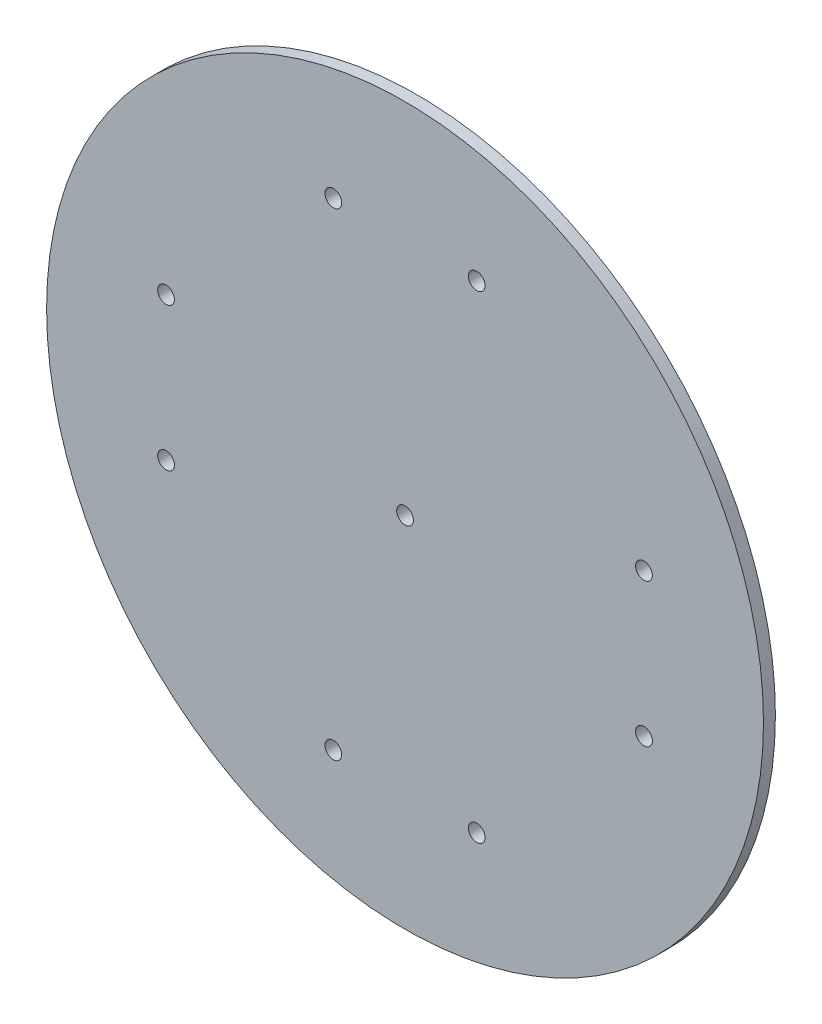
ISO-10303-21;
HEADER;
FILE_DESCRIPTION(('STEP AP214'),'2;1');
FILE_NAME('part.step','',(''),(''),'','','');
FILE_SCHEMA(('AUTOMOTIVE_DESIGN { 1 0 10303 214 1 1 1 1 }'));
ENDSEC;
DATA;
#1=APPLICATION_CONTEXT('core data for automotive mechanical design processes');
#2=APPLICATION_PROTOCOL_DEFINITION('international standard','automotive_design',2000,#1);
#3=PRODUCT_CONTEXT('',#1,'mechanical');
#4=PRODUCT('Part','Part','',(#3));
#5=PRODUCT_RELATED_PRODUCT_CATEGORY('part','',(#4));
#6=PRODUCT_DEFINITION_FORMATION('','',#4);
#7=PRODUCT_DEFINITION_CONTEXT('part definition',#1,'design');
#8=PRODUCT_DEFINITION('design','',#6,#7);
#9=PRODUCT_DEFINITION_SHAPE('','',#8);
#10=(LENGTH_UNIT() NAMED_UNIT(*) SI_UNIT(.MILLI.,.METRE.));
#11=(NAMED_UNIT(*) PLANE_ANGLE_UNIT() SI_UNIT($,.RADIAN.));
#12=(NAMED_UNIT(*) SI_UNIT($,.STERADIAN.) SOLID_ANGLE_UNIT());
#13=UNCERTAINTY_MEASURE_WITH_UNIT(LENGTH_MEASURE(1.E-05),#10,'distance_accuracy_value','');
#14=(GEOMETRIC_REPRESENTATION_CONTEXT(3) GLOBAL_UNCERTAINTY_ASSIGNED_CONTEXT((#13)) GLOBAL_UNIT_ASSIGNED_CONTEXT((#10,
#11,#12)) REPRESENTATION_CONTEXT('',''));
#15=CARTESIAN_POINT('',(0.,0.,0.));
#16=DIRECTION('',(0.,0.,1.));
#17=DIRECTION('',(1.,0.,0.));
#18=AXIS2_PLACEMENT_3D('',#15,#16,#17);
#19=CARTESIAN_POINT('',(0.,0.,2.5));
#20=DIRECTION('',(0.,0.,-1.));
#21=DIRECTION('',(-1.,0.,0.));
#22=AXIS2_PLACEMENT_3D('',#19,#20,#21);
#23=CYLINDRICAL_SURFACE('',#22,75.);
#24=CARTESIAN_POINT('',(0.,0.,2.5));
#25=DIRECTION('',(0.,0.,1.));
#26=DIRECTION('',(1.,0.,0.));
#27=AXIS2_PLACEMENT_3D('',#24,#25,#26);
#28=CIRCLE('',#27,75.);
#29=CARTESIAN_POINT('',(75.,0.,2.5));
#30=VERTEX_POINT('',#29);
#31=EDGE_CURVE('E10',#30,#30,#28,.T.);
#32=ORIENTED_EDGE('',*,*,#31,.F.);
#33=EDGE_LOOP('',(#32));
#34=FACE_BOUND('',#33,.T.);
#35=CARTESIAN_POINT('',(0.,0.,0.));
#36=DIRECTION('',(0.,0.,1.));
#37=DIRECTION('',(1.,0.,0.));
#38=AXIS2_PLACEMENT_3D('',#35,#36,#37);
#39=CIRCLE('',#38,75.);
#40=CARTESIAN_POINT('',(75.,0.,0.));
#41=VERTEX_POINT('',#40);
#42=EDGE_CURVE('E38',#41,#41,#39,.T.);
#43=ORIENTED_EDGE('',*,*,#42,.T.);
#44=EDGE_LOOP('',(#43));
#45=FACE_BOUND('',#44,.T.);
#46=ADVANCED_FACE('F35',(#34,#45),#23,.T.);
#47=CARTESIAN_POINT('',(0.,0.,2.5));
#48=DIRECTION('',(0.,0.,1.));
#49=DIRECTION('',(1.,0.,0.));
#50=AXIS2_PLACEMENT_3D('',#47,#48,#49);
#51=PLANE('',#50);
#52=CARTESIAN_POINT('',(0.,0.,2.5));
#53=DIRECTION('',(0.,0.,-1.));
#54=DIRECTION('',(-1.,0.,0.));
#55=AXIS2_PLACEMENT_3D('',#52,#53,#54);
#56=CIRCLE('',#55,1.75);
#57=CARTESIAN_POINT('',(-1.75,0.,2.5));
#58=VERTEX_POINT('',#57);
#59=EDGE_CURVE('E70',#58,#58,#56,.T.);
#60=ORIENTED_EDGE('',*,*,#59,.T.);
#61=EDGE_LOOP('',(#60));
#62=FACE_BOUND('',#61,.T.);
#63=CARTESIAN_POINT('',(-50.,15.,2.5));
#64=DIRECTION('',(0.,0.,-1.));
#65=DIRECTION('',(-1.,0.,0.));
#66=AXIS2_PLACEMENT_3D('',#63,#64,#65);
#67=CIRCLE('',#66,1.75);
#68=CARTESIAN_POINT('',(-51.75,15.,2.5));
#69=VERTEX_POINT('',#68);
#70=EDGE_CURVE('E60',#69,#69,#67,.T.);
#71=ORIENTED_EDGE('',*,*,#70,.T.);
#72=EDGE_LOOP('',(#71));
#73=FACE_BOUND('',#72,.T.);
#74=CARTESIAN_POINT('',(15.,50.,2.5));
#75=DIRECTION('',(0.,0.,-1.));
#76=DIRECTION('',(-1.,0.,0.));
#77=AXIS2_PLACEMENT_3D('',#74,#75,#76);
#78=CIRCLE('',#77,1.75);
#79=CARTESIAN_POINT('',(13.25,50.,2.5));
#80=VERTEX_POINT('',#79);
#81=EDGE_CURVE('E53',#80,#80,#78,.T.);
#82=ORIENTED_EDGE('',*,*,#81,.T.);
#83=EDGE_LOOP('',(#82));
#84=FACE_BOUND('',#83,.T.);
#85=CARTESIAN_POINT('',(-15.,50.,2.5));
#86=DIRECTION('',(0.,0.,-1.));
#87=DIRECTION('',(-1.,0.,0.));
#88=AXIS2_PLACEMENT_3D('',#85,#86,#87);
#89=CIRCLE('',#88,1.75);
#90=CARTESIAN_POINT('',(-16.75,50.,2.5));
#91=VERTEX_POINT('',#90);
#92=EDGE_CURVE('E67',#91,#91,#89,.T.);
#93=ORIENTED_EDGE('',*,*,#92,.T.);
#94=EDGE_LOOP('',(#93));
#95=FACE_BOUND('',#94,.T.);
#96=CARTESIAN_POINT('',(-50.,-15.,2.5));
#97=DIRECTION('',(0.,0.,-1.));
#98=DIRECTION('',(-1.,0.,0.));
#99=AXIS2_PLACEMENT_3D('',#96,#97,#98);
#100=CIRCLE('',#99,1.75);
#101=CARTESIAN_POINT('',(-51.75,-15.,2.5));
#102=VERTEX_POINT('',#101);
#103=EDGE_CURVE('E66',#102,#102,#100,.T.);
#104=ORIENTED_EDGE('',*,*,#103,.T.);
#105=EDGE_LOOP('',(#104));
#106=FACE_BOUND('',#105,.T.);
#107=CARTESIAN_POINT('',(-15.,-50.,2.5));
#108=DIRECTION('',(0.,0.,-1.));
#109=DIRECTION('',(-1.,0.,0.));
#110=AXIS2_PLACEMENT_3D('',#107,#108,#109);
#111=CIRCLE('',#110,1.75);
#112=CARTESIAN_POINT('',(-16.75,-50.,2.5));
#113=VERTEX_POINT('',#112);
#114=EDGE_CURVE('E78',#113,#113,#111,.T.);
#115=ORIENTED_EDGE('',*,*,#114,.T.);
#116=EDGE_LOOP('',(#115));
#117=FACE_BOUND('',#116,.T.);
#118=CARTESIAN_POINT('',(15.,-50.,2.5));
#119=DIRECTION('',(0.,0.,-1.));
#120=DIRECTION('',(-1.,0.,0.));
#121=AXIS2_PLACEMENT_3D('',#118,#119,#120);
#122=CIRCLE('',#121,1.75);
#123=CARTESIAN_POINT('',(13.25,-50.,2.5));
#124=VERTEX_POINT('',#123);
#125=EDGE_CURVE('E84',#124,#124,#122,.T.);
#126=ORIENTED_EDGE('',*,*,#125,.T.);
#127=EDGE_LOOP('',(#126));
#128=FACE_BOUND('',#127,.T.);
#129=CARTESIAN_POINT('',(50.,-15.,2.5));
#130=DIRECTION('',(0.,0.,-1.));
#131=DIRECTION('',(-1.,0.,0.));
#132=AXIS2_PLACEMENT_3D('',#129,#130,#131);
#133=CIRCLE('',#132,1.75);
#134=CARTESIAN_POINT('',(48.25,-15.,2.5));
#135=VERTEX_POINT('',#134);
#136=EDGE_CURVE('E90',#135,#135,#133,.T.);
#137=ORIENTED_EDGE('',*,*,#136,.T.);
#138=EDGE_LOOP('',(#137));
#139=FACE_BOUND('',#138,.T.);
#140=CARTESIAN_POINT('',(50.,15.,2.5));
#141=DIRECTION('',(0.,0.,-1.));
#142=DIRECTION('',(-1.,0.,0.));
#143=AXIS2_PLACEMENT_3D('',#140,#141,#142);
#144=CIRCLE('',#143,1.75);
#145=CARTESIAN_POINT('',(48.25,15.,2.5));
#146=VERTEX_POINT('',#145);
#147=EDGE_CURVE('E45',#146,#146,#144,.T.);
#148=ORIENTED_EDGE('',*,*,#147,.T.);
#149=EDGE_LOOP('',(#148));
#150=FACE_BOUND('',#149,.T.);
#151=ORIENTED_EDGE('',*,*,#31,.T.);
#152=EDGE_LOOP('',(#151));
#153=FACE_BOUND('',#152,.T.);
#154=ADVANCED_FACE('F101',(#62,#73,#84,#95,#106,#117,#128,#139,#150,#153),#51,.T.);
#155=CARTESIAN_POINT('',(0.,0.,0.));
#156=DIRECTION('',(0.,0.,1.));
#157=DIRECTION('',(1.,0.,0.));
#158=AXIS2_PLACEMENT_3D('',#155,#156,#157);
#159=PLANE('',#158);
#160=CARTESIAN_POINT('',(0.,0.,0.));
#161=DIRECTION('',(0.,0.,-1.));
#162=DIRECTION('',(-1.,0.,0.));
#163=AXIS2_PLACEMENT_3D('',#160,#161,#162);
#164=CIRCLE('',#163,1.75);
#165=CARTESIAN_POINT('',(-1.75,0.,0.));
#166=VERTEX_POINT('',#165);
#167=EDGE_CURVE('E95',#166,#166,#164,.T.);
#168=ORIENTED_EDGE('',*,*,#167,.F.);
#169=EDGE_LOOP('',(#168));
#170=FACE_BOUND('',#169,.T.);
#171=CARTESIAN_POINT('',(-50.,15.,0.));
#172=DIRECTION('',(0.,0.,-1.));
#173=DIRECTION('',(-1.,0.,0.));
#174=AXIS2_PLACEMENT_3D('',#171,#172,#173);
#175=CIRCLE('',#174,1.75);
#176=CARTESIAN_POINT('',(-51.75,15.,0.));
#177=VERTEX_POINT('',#176);
#178=EDGE_CURVE('E63',#177,#177,#175,.T.);
#179=ORIENTED_EDGE('',*,*,#178,.F.);
#180=EDGE_LOOP('',(#179));
#181=FACE_BOUND('',#180,.T.);
#182=CARTESIAN_POINT('',(15.,50.,0.));
#183=DIRECTION('',(0.,0.,-1.));
#184=DIRECTION('',(-1.,0.,0.));
#185=AXIS2_PLACEMENT_3D('',#182,#183,#184);
#186=CIRCLE('',#185,1.75);
#187=CARTESIAN_POINT('',(13.25,50.,0.));
#188=VERTEX_POINT('',#187);
#189=EDGE_CURVE('E56',#188,#188,#186,.T.);
#190=ORIENTED_EDGE('',*,*,#189,.F.);
#191=EDGE_LOOP('',(#190));
#192=FACE_BOUND('',#191,.T.);
#193=CARTESIAN_POINT('',(-15.,50.,0.));
#194=DIRECTION('',(0.,0.,-1.));
#195=DIRECTION('',(-1.,0.,0.));
#196=AXIS2_PLACEMENT_3D('',#193,#194,#195);
#197=CIRCLE('',#196,1.75);
#198=CARTESIAN_POINT('',(-16.75,50.,0.));
#199=VERTEX_POINT('',#198);
#200=EDGE_CURVE('E57',#199,#199,#197,.T.);
#201=ORIENTED_EDGE('',*,*,#200,.F.);
#202=EDGE_LOOP('',(#201));
#203=FACE_BOUND('',#202,.T.);
#204=CARTESIAN_POINT('',(-50.,-15.,0.));
#205=DIRECTION('',(0.,0.,-1.));
#206=DIRECTION('',(-1.,0.,0.));
#207=AXIS2_PLACEMENT_3D('',#204,#205,#206);
#208=CIRCLE('',#207,1.75);
#209=CARTESIAN_POINT('',(-51.75,-15.,0.));
#210=VERTEX_POINT('',#209);
#211=EDGE_CURVE('E75',#210,#210,#208,.T.);
#212=ORIENTED_EDGE('',*,*,#211,.F.);
#213=EDGE_LOOP('',(#212));
#214=FACE_BOUND('',#213,.T.);
#215=CARTESIAN_POINT('',(-15.,-50.,0.));
#216=DIRECTION('',(0.,0.,-1.));
#217=DIRECTION('',(-1.,0.,0.));
#218=AXIS2_PLACEMENT_3D('',#215,#216,#217);
#219=CIRCLE('',#218,1.75);
#220=CARTESIAN_POINT('',(-16.75,-50.,0.));
#221=VERTEX_POINT('',#220);
#222=EDGE_CURVE('E81',#221,#221,#219,.T.);
#223=ORIENTED_EDGE('',*,*,#222,.F.);
#224=EDGE_LOOP('',(#223));
#225=FACE_BOUND('',#224,.T.);
#226=CARTESIAN_POINT('',(15.,-50.,0.));
#227=DIRECTION('',(0.,0.,-1.));
#228=DIRECTION('',(-1.,0.,0.));
#229=AXIS2_PLACEMENT_3D('',#226,#227,#228);
#230=CIRCLE('',#229,1.75);
#231=CARTESIAN_POINT('',(13.25,-50.,0.));
#232=VERTEX_POINT('',#231);
#233=EDGE_CURVE('E87',#232,#232,#230,.T.);
#234=ORIENTED_EDGE('',*,*,#233,.F.);
#235=EDGE_LOOP('',(#234));
#236=FACE_BOUND('',#235,.T.);
#237=CARTESIAN_POINT('',(50.,-15.,0.));
#238=DIRECTION('',(0.,0.,-1.));
#239=DIRECTION('',(-1.,0.,0.));
#240=AXIS2_PLACEMENT_3D('',#237,#238,#239);
#241=CIRCLE('',#240,1.75);
#242=CARTESIAN_POINT('',(48.25,-15.,0.));
#243=VERTEX_POINT('',#242);
#244=EDGE_CURVE('E50',#243,#243,#241,.T.);
#245=ORIENTED_EDGE('',*,*,#244,.F.);
#246=EDGE_LOOP('',(#245));
#247=FACE_BOUND('',#246,.T.);
#248=CARTESIAN_POINT('',(50.,15.,0.));
#249=DIRECTION('',(0.,0.,-1.));
#250=DIRECTION('',(-1.,0.,0.));
#251=AXIS2_PLACEMENT_3D('',#248,#249,#250);
#252=CIRCLE('',#251,1.75);
#253=CARTESIAN_POINT('',(48.25,15.,0.));
#254=VERTEX_POINT('',#253);
#255=EDGE_CURVE('E47',#254,#254,#252,.T.);
#256=ORIENTED_EDGE('',*,*,#255,.F.);
#257=EDGE_LOOP('',(#256));
#258=FACE_BOUND('',#257,.T.);
#259=ORIENTED_EDGE('',*,*,#42,.F.);
#260=EDGE_LOOP('',(#259));
#261=FACE_BOUND('',#260,.T.);
#262=ADVANCED_FACE('F111',(#170,#181,#192,#203,#214,#225,#236,#247,#258,#261),#159,.F.);
#263=CARTESIAN_POINT('',(50.,15.,2.5));
#264=DIRECTION('',(0.,0.,-1.));
#265=DIRECTION('',(-1.,0.,0.));
#266=AXIS2_PLACEMENT_3D('',#263,#264,#265);
#267=CYLINDRICAL_SURFACE('',#266,1.75);
#268=ORIENTED_EDGE('',*,*,#147,.F.);
#269=EDGE_LOOP('',(#268));
#270=FACE_BOUND('',#269,.T.);
#271=ORIENTED_EDGE('',*,*,#255,.T.);
#272=EDGE_LOOP('',(#271));
#273=FACE_BOUND('',#272,.T.);
#274=ADVANCED_FACE('F114',(#270,#273),#267,.F.);
#275=CARTESIAN_POINT('',(50.,-15.,2.5));
#276=DIRECTION('',(0.,0.,-1.));
#277=DIRECTION('',(-1.,0.,0.));
#278=AXIS2_PLACEMENT_3D('',#275,#276,#277);
#279=CYLINDRICAL_SURFACE('',#278,1.75);
#280=ORIENTED_EDGE('',*,*,#136,.F.);
#281=EDGE_LOOP('',(#280));
#282=FACE_BOUND('',#281,.T.);
#283=ORIENTED_EDGE('',*,*,#244,.T.);
#284=EDGE_LOOP('',(#283));
#285=FACE_BOUND('',#284,.T.);
#286=ADVANCED_FACE('F144',(#282,#285),#279,.F.);
#287=CARTESIAN_POINT('',(15.,-50.,2.5));
#288=DIRECTION('',(0.,0.,-1.));
#289=DIRECTION('',(-1.,0.,0.));
#290=AXIS2_PLACEMENT_3D('',#287,#288,#289);
#291=CYLINDRICAL_SURFACE('',#290,1.75);
#292=ORIENTED_EDGE('',*,*,#125,.F.);
#293=EDGE_LOOP('',(#292));
#294=FACE_BOUND('',#293,.T.);
#295=ORIENTED_EDGE('',*,*,#233,.T.);
#296=EDGE_LOOP('',(#295));
#297=FACE_BOUND('',#296,.T.);
#298=ADVANCED_FACE('F164',(#294,#297),#291,.F.);
#299=CARTESIAN_POINT('',(-15.,-50.,2.5));
#300=DIRECTION('',(0.,0.,-1.));
#301=DIRECTION('',(-1.,0.,0.));
#302=AXIS2_PLACEMENT_3D('',#299,#300,#301);
#303=CYLINDRICAL_SURFACE('',#302,1.75);
#304=ORIENTED_EDGE('',*,*,#114,.F.);
#305=EDGE_LOOP('',(#304));
#306=FACE_BOUND('',#305,.T.);
#307=ORIENTED_EDGE('',*,*,#222,.T.);
#308=EDGE_LOOP('',(#307));
#309=FACE_BOUND('',#308,.T.);
#310=ADVANCED_FACE('F160',(#306,#309),#303,.F.);
#311=CARTESIAN_POINT('',(-50.,-15.,2.5));
#312=DIRECTION('',(0.,0.,-1.));
#313=DIRECTION('',(-1.,0.,0.));
#314=AXIS2_PLACEMENT_3D('',#311,#312,#313);
#315=CYLINDRICAL_SURFACE('',#314,1.75);
#316=ORIENTED_EDGE('',*,*,#103,.F.);
#317=EDGE_LOOP('',(#316));
#318=FACE_BOUND('',#317,.T.);
#319=ORIENTED_EDGE('',*,*,#211,.T.);
#320=EDGE_LOOP('',(#319));
#321=FACE_BOUND('',#320,.T.);
#322=ADVANCED_FACE('F156',(#318,#321),#315,.F.);
#323=CARTESIAN_POINT('',(-15.,50.,2.5));
#324=DIRECTION('',(0.,0.,-1.));
#325=DIRECTION('',(-1.,0.,0.));
#326=AXIS2_PLACEMENT_3D('',#323,#324,#325);
#327=CYLINDRICAL_SURFACE('',#326,1.75);
#328=ORIENTED_EDGE('',*,*,#92,.F.);
#329=EDGE_LOOP('',(#328));
#330=FACE_BOUND('',#329,.T.);
#331=ORIENTED_EDGE('',*,*,#200,.T.);
#332=EDGE_LOOP('',(#331));
#333=FACE_BOUND('',#332,.T.);
#334=ADVANCED_FACE('F149',(#330,#333),#327,.F.);
#335=CARTESIAN_POINT('',(15.,50.,2.5));
#336=DIRECTION('',(0.,0.,-1.));
#337=DIRECTION('',(-1.,0.,0.));
#338=AXIS2_PLACEMENT_3D('',#335,#336,#337);
#339=CYLINDRICAL_SURFACE('',#338,1.75);
#340=ORIENTED_EDGE('',*,*,#81,.F.);
#341=EDGE_LOOP('',(#340));
#342=FACE_BOUND('',#341,.T.);
#343=ORIENTED_EDGE('',*,*,#189,.T.);
#344=EDGE_LOOP('',(#343));
#345=FACE_BOUND('',#344,.T.);
#346=ADVANCED_FACE('F146',(#342,#345),#339,.F.);
#347=CARTESIAN_POINT('',(-50.,15.,2.5));
#348=DIRECTION('',(0.,0.,-1.));
#349=DIRECTION('',(-1.,0.,0.));
#350=AXIS2_PLACEMENT_3D('',#347,#348,#349);
#351=CYLINDRICAL_SURFACE('',#350,1.75);
#352=ORIENTED_EDGE('',*,*,#70,.F.);
#353=EDGE_LOOP('',(#352));
#354=FACE_BOUND('',#353,.T.);
#355=ORIENTED_EDGE('',*,*,#178,.T.);
#356=EDGE_LOOP('',(#355));
#357=FACE_BOUND('',#356,.T.);
#358=ADVANCED_FACE('F107',(#354,#357),#351,.F.);
#359=CARTESIAN_POINT('',(0.,0.,2.5));
#360=DIRECTION('',(0.,0.,-1.));
#361=DIRECTION('',(-1.,0.,0.));
#362=AXIS2_PLACEMENT_3D('',#359,#360,#361);
#363=CYLINDRICAL_SURFACE('',#362,1.75);
#364=ORIENTED_EDGE('',*,*,#59,.F.);
#365=EDGE_LOOP('',(#364));
#366=FACE_BOUND('',#365,.T.);
#367=ORIENTED_EDGE('',*,*,#167,.T.);
#368=EDGE_LOOP('',(#367));
#369=FACE_BOUND('',#368,.T.);
#370=ADVANCED_FACE('F104',(#366,#369),#363,.F.);
#371=CLOSED_SHELL('',(#46,#154,#262,#274,#286,#298,#310,#322,#334,#346,#358,#370));
#372=MANIFOLD_SOLID_BREP('B2',#371);
#373=ADVANCED_BREP_SHAPE_REPRESENTATION('',(#18,#372),#14);
#374=SHAPE_DEFINITION_REPRESENTATION(#9,#373);
ENDSEC;
END-ISO-10303-21;
